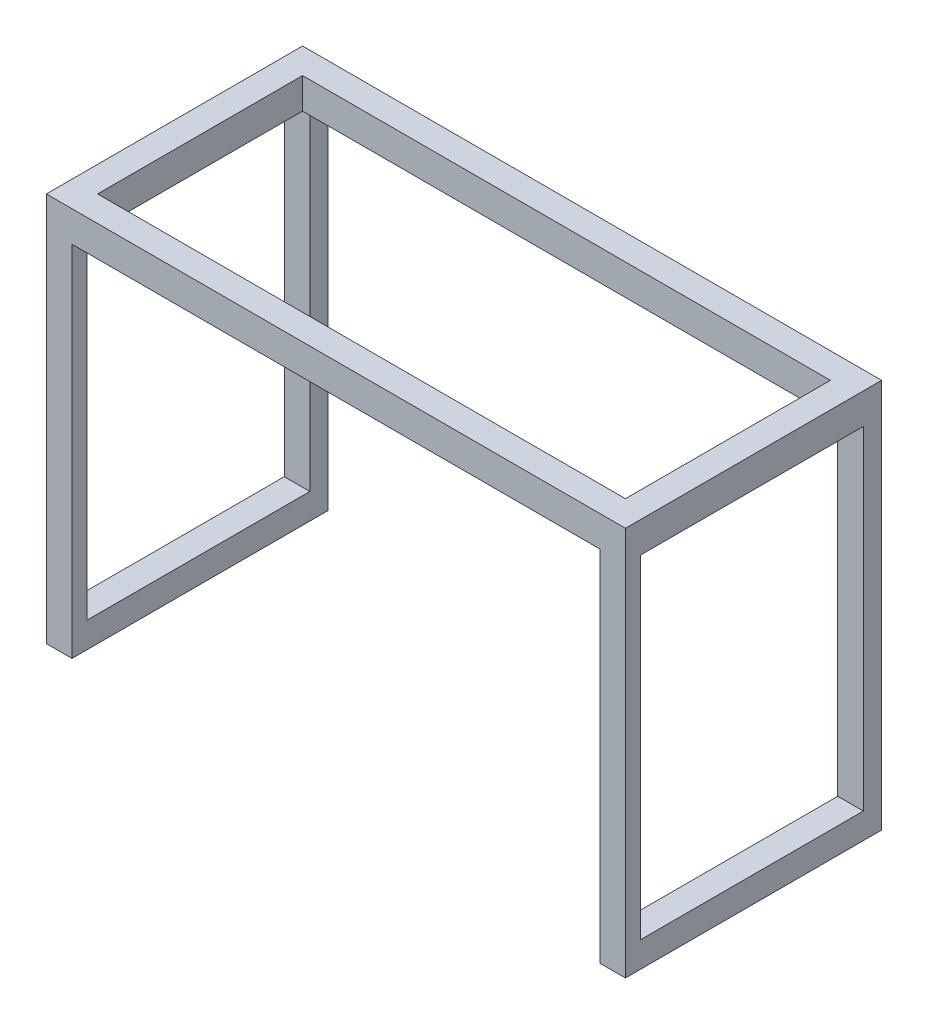
ISO-10303-21;
HEADER;
FILE_DESCRIPTION(('STEP AP214'),'2;1');
FILE_NAME('part.step','',(''),(''),'','','');
FILE_SCHEMA(('AUTOMOTIVE_DESIGN { 1 0 10303 214 1 1 1 1 }'));
ENDSEC;
DATA;
#1=APPLICATION_CONTEXT('core data for automotive mechanical design processes');
#2=APPLICATION_PROTOCOL_DEFINITION('international standard','automotive_design',2000,#1);
#3=PRODUCT_CONTEXT('',#1,'mechanical');
#4=PRODUCT('Part','Part','',(#3));
#5=PRODUCT_RELATED_PRODUCT_CATEGORY('part','',(#4));
#6=PRODUCT_DEFINITION_FORMATION('','',#4);
#7=PRODUCT_DEFINITION_CONTEXT('part definition',#1,'design');
#8=PRODUCT_DEFINITION('design','',#6,#7);
#9=PRODUCT_DEFINITION_SHAPE('','',#8);
#10=(LENGTH_UNIT() NAMED_UNIT(*) SI_UNIT(.MILLI.,.METRE.));
#11=(NAMED_UNIT(*) PLANE_ANGLE_UNIT() SI_UNIT($,.RADIAN.));
#12=(NAMED_UNIT(*) SI_UNIT($,.STERADIAN.) SOLID_ANGLE_UNIT());
#13=UNCERTAINTY_MEASURE_WITH_UNIT(LENGTH_MEASURE(1.E-05),#10,'distance_accuracy_value','');
#14=(GEOMETRIC_REPRESENTATION_CONTEXT(3) GLOBAL_UNCERTAINTY_ASSIGNED_CONTEXT((#13)) GLOBAL_UNIT_ASSIGNED_CONTEXT((#10,
#11,#12)) REPRESENTATION_CONTEXT('',''));
#15=CARTESIAN_POINT('',(0.,0.,0.));
#16=DIRECTION('',(0.,0.,1.));
#17=DIRECTION('',(1.,0.,0.));
#18=AXIS2_PLACEMENT_3D('',#15,#16,#17);
#19=CARTESIAN_POINT('',(-515.,0.,200.));
#20=DIRECTION('',(-1.,0.,0.));
#21=DIRECTION('',(0.,0.,1.));
#22=AXIS2_PLACEMENT_3D('',#19,#20,#21);
#23=PLANE('',#22);
#24=DIRECTION('',(0.,1.,0.));
#25=VECTOR('',#24,1.);
#26=CARTESIAN_POINT('',(-515.,0.,200.));
#27=LINE('',#26,#25);
#28=CARTESIAN_POINT('',(-515.,0.,200.));
#29=VERTEX_POINT('',#28);
#30=CARTESIAN_POINT('',(-515.,60.,200.));
#31=VERTEX_POINT('',#30);
#32=EDGE_CURVE('E275',#29,#31,#27,.T.);
#33=ORIENTED_EDGE('',*,*,#32,.F.);
#34=DIRECTION('',(0.,0.,-1.));
#35=VECTOR('',#34,1.);
#36=CARTESIAN_POINT('',(-515.,0.,200.));
#37=LINE('',#36,#35);
#38=CARTESIAN_POINT('',(-515.,0.,-200.));
#39=VERTEX_POINT('',#38);
#40=EDGE_CURVE('E208',#29,#39,#37,.T.);
#41=ORIENTED_EDGE('',*,*,#40,.T.);
#42=DIRECTION('',(0.,1.,0.));
#43=VECTOR('',#42,1.);
#44=CARTESIAN_POINT('',(-515.,0.,-200.));
#45=LINE('',#44,#43);
#46=CARTESIAN_POINT('',(-515.,60.,-200.));
#47=VERTEX_POINT('',#46);
#48=EDGE_CURVE('E285',#39,#47,#45,.T.);
#49=ORIENTED_EDGE('',*,*,#48,.T.);
#50=DIRECTION('',(0.,0.,1.));
#51=VECTOR('',#50,1.);
#52=CARTESIAN_POINT('',(-515.,60.,200.));
#53=LINE('',#52,#51);
#54=EDGE_CURVE('E267',#47,#31,#53,.T.);
#55=ORIENTED_EDGE('',*,*,#54,.T.);
#56=EDGE_LOOP('',(#33,#41,#49,#55));
#57=FACE_BOUND('',#56,.T.);
#58=ADVANCED_FACE('F35',(#57),#23,.F.);
#59=CARTESIAN_POINT('',(515.,0.,200.));
#60=DIRECTION('',(1.,0.,0.));
#61=DIRECTION('',(0.,0.,-1.));
#62=AXIS2_PLACEMENT_3D('',#59,#60,#61);
#63=PLANE('',#62);
#64=DIRECTION('',(0.,1.,0.));
#65=VECTOR('',#64,1.);
#66=CARTESIAN_POINT('',(515.,0.,-200.));
#67=LINE('',#66,#65);
#68=CARTESIAN_POINT('',(515.,0.,-200.));
#69=VERTEX_POINT('',#68);
#70=CARTESIAN_POINT('',(515.,60.,-200.));
#71=VERTEX_POINT('',#70);
#72=EDGE_CURVE('E288',#69,#71,#67,.T.);
#73=ORIENTED_EDGE('',*,*,#72,.F.);
#74=DIRECTION('',(0.,0.,1.));
#75=VECTOR('',#74,1.);
#76=CARTESIAN_POINT('',(515.,0.,200.));
#77=LINE('',#76,#75);
#78=CARTESIAN_POINT('',(515.,0.,200.));
#79=VERTEX_POINT('',#78);
#80=EDGE_CURVE('E205',#69,#79,#77,.T.);
#81=ORIENTED_EDGE('',*,*,#80,.T.);
#82=DIRECTION('',(0.,1.,0.));
#83=VECTOR('',#82,1.);
#84=CARTESIAN_POINT('',(515.,0.,200.));
#85=LINE('',#84,#83);
#86=CARTESIAN_POINT('',(515.,60.,200.));
#87=VERTEX_POINT('',#86);
#88=EDGE_CURVE('E290',#79,#87,#85,.T.);
#89=ORIENTED_EDGE('',*,*,#88,.T.);
#90=DIRECTION('',(0.,0.,-1.));
#91=VECTOR('',#90,1.);
#92=CARTESIAN_POINT('',(515.,60.,200.));
#93=LINE('',#92,#91);
#94=EDGE_CURVE('E280',#87,#71,#93,.T.);
#95=ORIENTED_EDGE('',*,*,#94,.T.);
#96=EDGE_LOOP('',(#73,#81,#89,#95));
#97=FACE_BOUND('',#96,.T.);
#98=ADVANCED_FACE('F382',(#97),#63,.F.);
#99=CARTESIAN_POINT('',(0.,0.,0.));
#100=DIRECTION('',(0.,1.,0.));
#101=DIRECTION('',(0.,0.,1.));
#102=AXIS2_PLACEMENT_3D('',#99,#100,#101);
#103=PLANE('',#102);
#104=DIRECTION('',(0.,0.,-1.));
#105=VECTOR('',#104,1.);
#106=CARTESIAN_POINT('',(515.,0.,250.));
#107=LINE('',#106,#105);
#108=CARTESIAN_POINT('',(515.,0.,-214.273357981474));
#109=VERTEX_POINT('',#108);
#110=CARTESIAN_POINT('',(515.,0.,-250.));
#111=VERTEX_POINT('',#110);
#112=EDGE_CURVE('E227',#109,#111,#107,.T.);
#113=ORIENTED_EDGE('',*,*,#112,.F.);
#114=DIRECTION('',(-1.,0.,0.));
#115=VECTOR('',#114,1.);
#116=CARTESIAN_POINT('',(1337.,0.,-214.273357981474));
#117=LINE('',#116,#115);
#118=CARTESIAN_POINT('',(565.,0.,-214.273357981474));
#119=VERTEX_POINT('',#118);
#120=EDGE_CURVE('E200',#119,#109,#117,.T.);
#121=ORIENTED_EDGE('',*,*,#120,.F.);
#122=DIRECTION('',(0.,0.,-1.));
#123=VECTOR('',#122,1.);
#124=CARTESIAN_POINT('',(565.,0.,250.));
#125=LINE('',#124,#123);
#126=CARTESIAN_POINT('',(565.,0.,220.54477333703));
#127=VERTEX_POINT('',#126);
#128=EDGE_CURVE('E207',#127,#119,#125,.T.);
#129=ORIENTED_EDGE('',*,*,#128,.F.);
#130=DIRECTION('',(-1.,0.,0.));
#131=VECTOR('',#130,1.);
#132=CARTESIAN_POINT('',(1337.,0.,220.54477333703));
#133=LINE('',#132,#131);
#134=CARTESIAN_POINT('',(515.,0.,220.54477333703));
#135=VERTEX_POINT('',#134);
#136=EDGE_CURVE('E201',#127,#135,#133,.T.);
#137=ORIENTED_EDGE('',*,*,#136,.T.);
#138=CARTESIAN_POINT('',(515.,0.,250.));
#139=VERTEX_POINT('',#138);
#140=EDGE_CURVE('E232',#139,#135,#107,.T.);
#141=ORIENTED_EDGE('',*,*,#140,.F.);
#142=DIRECTION('',(1.,0.,0.));
#143=VECTOR('',#142,1.);
#144=CARTESIAN_POINT('',(565.,0.,250.));
#145=LINE('',#144,#143);
#146=CARTESIAN_POINT('',(-515.,0.,250.));
#147=VERTEX_POINT('',#146);
#148=EDGE_CURVE('E287',#147,#139,#145,.T.);
#149=ORIENTED_EDGE('',*,*,#148,.F.);
#150=DIRECTION('',(0.,0.,1.));
#151=VECTOR('',#150,1.);
#152=CARTESIAN_POINT('',(-515.,0.,250.));
#153=LINE('',#152,#151);
#154=CARTESIAN_POINT('',(-515.,0.,220.54477333703));
#155=VERTEX_POINT('',#154);
#156=EDGE_CURVE('E261',#155,#147,#153,.T.);
#157=ORIENTED_EDGE('',*,*,#156,.F.);
#158=CARTESIAN_POINT('',(-565.,0.,220.54477333703));
#159=VERTEX_POINT('',#158);
#160=EDGE_CURVE('E202',#155,#159,#133,.T.);
#161=ORIENTED_EDGE('',*,*,#160,.T.);
#162=DIRECTION('',(0.,0.,-1.));
#163=VECTOR('',#162,1.);
#164=CARTESIAN_POINT('',(-565.,0.,-214.273357981474));
#165=LINE('',#164,#163);
#166=CARTESIAN_POINT('',(-565.,0.,-214.273357981474));
#167=VERTEX_POINT('',#166);
#168=EDGE_CURVE('E193',#159,#167,#165,.T.);
#169=ORIENTED_EDGE('',*,*,#168,.T.);
#170=CARTESIAN_POINT('',(-515.,0.,-214.273357981474));
#171=VERTEX_POINT('',#170);
#172=EDGE_CURVE('E198',#171,#167,#117,.T.);
#173=ORIENTED_EDGE('',*,*,#172,.F.);
#174=CARTESIAN_POINT('',(-515.,0.,-250.));
#175=VERTEX_POINT('',#174);
#176=EDGE_CURVE('E247',#175,#171,#153,.T.);
#177=ORIENTED_EDGE('',*,*,#176,.F.);
#178=DIRECTION('',(-1.,0.,0.));
#179=VECTOR('',#178,1.);
#180=CARTESIAN_POINT('',(565.,0.,-250.));
#181=LINE('',#180,#179);
#182=EDGE_CURVE('E298',#111,#175,#181,.T.);
#183=ORIENTED_EDGE('',*,*,#182,.F.);
#184=EDGE_LOOP('',(#113,#121,#129,#137,#141,#149,#157,#161,#169,#173,#177,#183));
#185=FACE_BOUND('',#184,.T.);
#186=ORIENTED_EDGE('',*,*,#40,.F.);
#187=DIRECTION('',(1.,0.,0.));
#188=VECTOR('',#187,1.);
#189=CARTESIAN_POINT('',(515.,0.,200.));
#190=LINE('',#189,#188);
#191=EDGE_CURVE('E268',#29,#79,#190,.T.);
#192=ORIENTED_EDGE('',*,*,#191,.T.);
#193=ORIENTED_EDGE('',*,*,#80,.F.);
#194=DIRECTION('',(-1.,0.,0.));
#195=VECTOR('',#194,1.);
#196=CARTESIAN_POINT('',(515.,0.,-200.));
#197=LINE('',#196,#195);
#198=EDGE_CURVE('E271',#69,#39,#197,.T.);
#199=ORIENTED_EDGE('',*,*,#198,.T.);
#200=EDGE_LOOP('',(#186,#192,#193,#199));
#201=FACE_BOUND('',#200,.T.);
#202=ADVANCED_FACE('F326',(#185,#201),#103,.F.);
#203=CARTESIAN_POINT('',(-565.,60.,250.));
#204=DIRECTION('',(1.,0.,0.));
#205=DIRECTION('',(0.,0.,-1.));
#206=AXIS2_PLACEMENT_3D('',#203,#204,#205);
#207=PLANE('',#206);
#208=DIRECTION('',(0.,0.,1.));
#209=VECTOR('',#208,1.);
#210=CARTESIAN_POINT('',(-565.,-650.,-214.273357981474));
#211=LINE('',#210,#209);
#212=CARTESIAN_POINT('',(-565.,-650.,-214.273357981474));
#213=VERTEX_POINT('',#212);
#214=CARTESIAN_POINT('',(-565.,-650.,220.54477333703));
#215=VERTEX_POINT('',#214);
#216=EDGE_CURVE('E186',#213,#215,#211,.T.);
#217=ORIENTED_EDGE('',*,*,#216,.F.);
#218=DIRECTION('',(0.,-1.,0.));
#219=VECTOR('',#218,1.);
#220=CARTESIAN_POINT('',(-565.,0.,-214.273357981474));
#221=LINE('',#220,#219);
#222=EDGE_CURVE('E50',#167,#213,#221,.T.);
#223=ORIENTED_EDGE('',*,*,#222,.F.);
#224=ORIENTED_EDGE('',*,*,#168,.F.);
#225=DIRECTION('',(0.,1.,0.));
#226=VECTOR('',#225,1.);
#227=CARTESIAN_POINT('',(-565.,0.,220.54477333703));
#228=LINE('',#227,#226);
#229=EDGE_CURVE('E177',#215,#159,#228,.T.);
#230=ORIENTED_EDGE('',*,*,#229,.F.);
#231=EDGE_LOOP('',(#217,#223,#224,#230));
#232=FACE_BOUND('',#231,.T.);
#233=DIRECTION('',(0.,-1.,0.));
#234=VECTOR('',#233,1.);
#235=CARTESIAN_POINT('',(-565.,60.,-250.));
#236=LINE('',#235,#234);
#237=CARTESIAN_POINT('',(-565.,60.,-250.));
#238=VERTEX_POINT('',#237);
#239=CARTESIAN_POINT('',(-565.,-700.,-250.));
#240=VERTEX_POINT('',#239);
#241=EDGE_CURVE('E304',#238,#240,#236,.T.);
#242=ORIENTED_EDGE('',*,*,#241,.T.);
#243=DIRECTION('',(0.,0.,-1.));
#244=VECTOR('',#243,1.);
#245=CARTESIAN_POINT('',(-565.,-700.,250.));
#246=LINE('',#245,#244);
#247=CARTESIAN_POINT('',(-565.,-700.,250.));
#248=VERTEX_POINT('',#247);
#249=EDGE_CURVE('E248',#248,#240,#246,.T.);
#250=ORIENTED_EDGE('',*,*,#249,.F.);
#251=DIRECTION('',(0.,-1.,0.));
#252=VECTOR('',#251,1.);
#253=CARTESIAN_POINT('',(-565.,60.,250.));
#254=LINE('',#253,#252);
#255=CARTESIAN_POINT('',(-565.,60.,250.));
#256=VERTEX_POINT('',#255);
#257=EDGE_CURVE('E313',#256,#248,#254,.T.);
#258=ORIENTED_EDGE('',*,*,#257,.F.);
#259=DIRECTION('',(0.,0.,1.));
#260=VECTOR('',#259,1.);
#261=CARTESIAN_POINT('',(-565.,60.,250.));
#262=LINE('',#261,#260);
#263=EDGE_CURVE('E294',#238,#256,#262,.T.);
#264=ORIENTED_EDGE('',*,*,#263,.F.);
#265=EDGE_LOOP('',(#242,#250,#258,#264));
#266=FACE_BOUND('',#265,.T.);
#267=ADVANCED_FACE('F37',(#232,#266),#207,.F.);
#268=CARTESIAN_POINT('',(565.,60.,250.));
#269=DIRECTION('',(0.,0.,-1.));
#270=DIRECTION('',(-1.,0.,0.));
#271=AXIS2_PLACEMENT_3D('',#268,#269,#270);
#272=PLANE('',#271);
#273=ORIENTED_EDGE('',*,*,#257,.T.);
#274=DIRECTION('',(-1.,0.,0.));
#275=VECTOR('',#274,1.);
#276=CARTESIAN_POINT('',(-565.,-700.,250.));
#277=LINE('',#276,#275);
#278=CARTESIAN_POINT('',(-515.,-700.,250.));
#279=VERTEX_POINT('',#278);
#280=EDGE_CURVE('E255',#279,#248,#277,.T.);
#281=ORIENTED_EDGE('',*,*,#280,.F.);
#282=DIRECTION('',(0.,1.,0.));
#283=VECTOR('',#282,1.);
#284=CARTESIAN_POINT('',(-515.,-700.,250.));
#285=LINE('',#284,#283);
#286=EDGE_CURVE('E258',#279,#147,#285,.T.);
#287=ORIENTED_EDGE('',*,*,#286,.T.);
#288=ORIENTED_EDGE('',*,*,#148,.T.);
#289=DIRECTION('',(0.,1.,0.));
#290=VECTOR('',#289,1.);
#291=CARTESIAN_POINT('',(515.,-700.,250.));
#292=LINE('',#291,#290);
#293=CARTESIAN_POINT('',(515.,-700.,250.));
#294=VERTEX_POINT('',#293);
#295=EDGE_CURVE('E244',#294,#139,#292,.T.);
#296=ORIENTED_EDGE('',*,*,#295,.F.);
#297=DIRECTION('',(-1.,0.,0.));
#298=VECTOR('',#297,1.);
#299=CARTESIAN_POINT('',(565.,-700.,250.));
#300=LINE('',#299,#298);
#301=CARTESIAN_POINT('',(565.,-700.,250.));
#302=VERTEX_POINT('',#301);
#303=EDGE_CURVE('E231',#302,#294,#300,.T.);
#304=ORIENTED_EDGE('',*,*,#303,.F.);
#305=DIRECTION('',(0.,-1.,0.));
#306=VECTOR('',#305,1.);
#307=CARTESIAN_POINT('',(565.,60.,250.));
#308=LINE('',#307,#306);
#309=CARTESIAN_POINT('',(565.,60.,250.));
#310=VERTEX_POINT('',#309);
#311=EDGE_CURVE('E311',#310,#302,#308,.T.);
#312=ORIENTED_EDGE('',*,*,#311,.F.);
#313=DIRECTION('',(1.,0.,0.));
#314=VECTOR('',#313,1.);
#315=CARTESIAN_POINT('',(565.,60.,250.));
#316=LINE('',#315,#314);
#317=EDGE_CURVE('E297',#256,#310,#316,.T.);
#318=ORIENTED_EDGE('',*,*,#317,.F.);
#319=EDGE_LOOP('',(#273,#281,#287,#288,#296,#304,#312,#318));
#320=FACE_BOUND('',#319,.T.);
#321=ADVANCED_FACE('F354',(#320),#272,.F.);
#322=CARTESIAN_POINT('',(565.,60.,250.));
#323=DIRECTION('',(-1.,0.,0.));
#324=DIRECTION('',(0.,0.,1.));
#325=AXIS2_PLACEMENT_3D('',#322,#323,#324);
#326=PLANE('',#325);
#327=ORIENTED_EDGE('',*,*,#128,.T.);
#328=DIRECTION('',(0.,-1.,0.));
#329=VECTOR('',#328,1.);
#330=CARTESIAN_POINT('',(565.,59.9999999999999,-214.273357981474));
#331=LINE('',#330,#329);
#332=CARTESIAN_POINT('',(565.,-650.,-214.273357981474));
#333=VERTEX_POINT('',#332);
#334=EDGE_CURVE('E224',#119,#333,#331,.T.);
#335=ORIENTED_EDGE('',*,*,#334,.T.);
#336=DIRECTION('',(0.,0.,1.));
#337=VECTOR('',#336,1.);
#338=CARTESIAN_POINT('',(565.,-650.,250.));
#339=LINE('',#338,#337);
#340=CARTESIAN_POINT('',(565.,-650.,220.54477333703));
#341=VERTEX_POINT('',#340);
#342=EDGE_CURVE('E214',#333,#341,#339,.T.);
#343=ORIENTED_EDGE('',*,*,#342,.T.);
#344=DIRECTION('',(0.,1.,0.));
#345=VECTOR('',#344,1.);
#346=CARTESIAN_POINT('',(565.,60.,220.54477333703));
#347=LINE('',#346,#345);
#348=EDGE_CURVE('E218',#341,#127,#347,.T.);
#349=ORIENTED_EDGE('',*,*,#348,.T.);
#350=EDGE_LOOP('',(#327,#335,#343,#349));
#351=FACE_BOUND('',#350,.T.);
#352=ORIENTED_EDGE('',*,*,#311,.T.);
#353=DIRECTION('',(0.,0.,1.));
#354=VECTOR('',#353,1.);
#355=CARTESIAN_POINT('',(565.,-700.,250.));
#356=LINE('',#355,#354);
#357=CARTESIAN_POINT('',(565.,-700.,-249.999999999999));
#358=VERTEX_POINT('',#357);
#359=EDGE_CURVE('E228',#358,#302,#356,.T.);
#360=ORIENTED_EDGE('',*,*,#359,.F.);
#361=DIRECTION('',(0.,-1.,0.));
#362=VECTOR('',#361,1.);
#363=CARTESIAN_POINT('',(565.,60.,-250.));
#364=LINE('',#363,#362);
#365=CARTESIAN_POINT('',(565.,60.,-250.));
#366=VERTEX_POINT('',#365);
#367=EDGE_CURVE('E309',#366,#358,#364,.T.);
#368=ORIENTED_EDGE('',*,*,#367,.F.);
#369=DIRECTION('',(0.,0.,-1.));
#370=VECTOR('',#369,1.);
#371=CARTESIAN_POINT('',(565.,60.,250.));
#372=LINE('',#371,#370);
#373=EDGE_CURVE('E300',#310,#366,#372,.T.);
#374=ORIENTED_EDGE('',*,*,#373,.F.);
#375=EDGE_LOOP('',(#352,#360,#368,#374));
#376=FACE_BOUND('',#375,.T.);
#377=ADVANCED_FACE('F331',(#351,#376),#326,.F.);
#378=CARTESIAN_POINT('',(565.,60.,-250.));
#379=DIRECTION('',(0.,0.,1.));
#380=DIRECTION('',(1.,0.,0.));
#381=AXIS2_PLACEMENT_3D('',#378,#379,#380);
#382=PLANE('',#381);
#383=ORIENTED_EDGE('',*,*,#367,.T.);
#384=DIRECTION('',(1.,0.,0.));
#385=VECTOR('',#384,1.);
#386=CARTESIAN_POINT('',(565.,-700.,-249.999999999999));
#387=LINE('',#386,#385);
#388=CARTESIAN_POINT('',(515.,-700.,-249.999999999999));
#389=VERTEX_POINT('',#388);
#390=EDGE_CURVE('E236',#389,#358,#387,.T.);
#391=ORIENTED_EDGE('',*,*,#390,.F.);
#392=DIRECTION('',(0.,1.,0.));
#393=VECTOR('',#392,1.);
#394=CARTESIAN_POINT('',(515.,-700.,-249.999999999999));
#395=LINE('',#394,#393);
#396=EDGE_CURVE('E239',#389,#111,#395,.T.);
#397=ORIENTED_EDGE('',*,*,#396,.T.);
#398=ORIENTED_EDGE('',*,*,#182,.T.);
#399=DIRECTION('',(0.,1.,0.));
#400=VECTOR('',#399,1.);
#401=CARTESIAN_POINT('',(-515.,-700.,-250.));
#402=LINE('',#401,#400);
#403=CARTESIAN_POINT('',(-515.,-700.,-250.));
#404=VERTEX_POINT('',#403);
#405=EDGE_CURVE('E264',#404,#175,#402,.T.);
#406=ORIENTED_EDGE('',*,*,#405,.F.);
#407=DIRECTION('',(1.,0.,0.));
#408=VECTOR('',#407,1.);
#409=CARTESIAN_POINT('',(-565.,-700.,-250.));
#410=LINE('',#409,#408);
#411=EDGE_CURVE('E251',#240,#404,#410,.T.);
#412=ORIENTED_EDGE('',*,*,#411,.F.);
#413=ORIENTED_EDGE('',*,*,#241,.F.);
#414=DIRECTION('',(-1.,0.,0.));
#415=VECTOR('',#414,1.);
#416=CARTESIAN_POINT('',(565.,60.,-250.));
#417=LINE('',#416,#415);
#418=EDGE_CURVE('E302',#366,#238,#417,.T.);
#419=ORIENTED_EDGE('',*,*,#418,.F.);
#420=EDGE_LOOP('',(#383,#391,#397,#398,#406,#412,#413,#419));
#421=FACE_BOUND('',#420,.T.);
#422=ADVANCED_FACE('F345',(#421),#382,.F.);
#423=CARTESIAN_POINT('',(0.,60.,0.));
#424=DIRECTION('',(0.,1.,0.));
#425=DIRECTION('',(0.,0.,1.));
#426=AXIS2_PLACEMENT_3D('',#423,#424,#425);
#427=PLANE('',#426);
#428=ORIENTED_EDGE('',*,*,#54,.F.);
#429=DIRECTION('',(-1.,0.,0.));
#430=VECTOR('',#429,1.);
#431=CARTESIAN_POINT('',(515.,60.,-200.));
#432=LINE('',#431,#430);
#433=EDGE_CURVE('E272',#71,#47,#432,.T.);
#434=ORIENTED_EDGE('',*,*,#433,.F.);
#435=ORIENTED_EDGE('',*,*,#94,.F.);
#436=DIRECTION('',(1.,0.,0.));
#437=VECTOR('',#436,1.);
#438=CARTESIAN_POINT('',(515.,60.,200.));
#439=LINE('',#438,#437);
#440=EDGE_CURVE('E277',#31,#87,#439,.T.);
#441=ORIENTED_EDGE('',*,*,#440,.F.);
#442=EDGE_LOOP('',(#428,#434,#435,#441));
#443=FACE_BOUND('',#442,.T.);
#444=ORIENTED_EDGE('',*,*,#263,.T.);
#445=ORIENTED_EDGE('',*,*,#317,.T.);
#446=ORIENTED_EDGE('',*,*,#373,.T.);
#447=ORIENTED_EDGE('',*,*,#418,.T.);
#448=EDGE_LOOP('',(#444,#445,#446,#447));
#449=FACE_BOUND('',#448,.T.);
#450=ADVANCED_FACE('F371',(#443,#449),#427,.T.);
#451=ORIENTED_EDGE('',*,*,#176,.T.);
#452=DIRECTION('',(0.,-1.,0.));
#453=VECTOR('',#452,1.);
#454=CARTESIAN_POINT('',(-515.,0.,-214.273357981474));
#455=LINE('',#454,#453);
#456=CARTESIAN_POINT('',(-515.,-650.,-214.273357981474));
#457=VERTEX_POINT('',#456);
#458=EDGE_CURVE('E221',#171,#457,#455,.T.);
#459=ORIENTED_EDGE('',*,*,#458,.T.);
#460=DIRECTION('',(0.,0.,1.));
#461=VECTOR('',#460,1.);
#462=CARTESIAN_POINT('',(-515.,-650.,200.));
#463=LINE('',#462,#461);
#464=CARTESIAN_POINT('',(-515.,-650.,220.54477333703));
#465=VERTEX_POINT('',#464);
#466=EDGE_CURVE('E212',#457,#465,#463,.T.);
#467=ORIENTED_EDGE('',*,*,#466,.T.);
#468=DIRECTION('',(0.,1.,0.));
#469=VECTOR('',#468,1.);
#470=CARTESIAN_POINT('',(-515.,0.,220.54477333703));
#471=LINE('',#470,#469);
#472=EDGE_CURVE('E180',#465,#155,#471,.T.);
#473=ORIENTED_EDGE('',*,*,#472,.T.);
#474=ORIENTED_EDGE('',*,*,#156,.T.);
#475=ORIENTED_EDGE('',*,*,#286,.F.);
#476=DIRECTION('',(0.,0.,1.));
#477=VECTOR('',#476,1.);
#478=CARTESIAN_POINT('',(-515.,-700.,250.));
#479=LINE('',#478,#477);
#480=EDGE_CURVE('E253',#404,#279,#479,.T.);
#481=ORIENTED_EDGE('',*,*,#480,.F.);
#482=ORIENTED_EDGE('',*,*,#405,.T.);
#483=EDGE_LOOP('',(#451,#459,#467,#473,#474,#475,#481,#482));
#484=FACE_BOUND('',#483,.T.);
#485=ADVANCED_FACE('F359',(#484),#23,.F.);
#486=CARTESIAN_POINT('',(515.,0.,-200.));
#487=DIRECTION('',(0.,0.,-1.));
#488=DIRECTION('',(-1.,0.,0.));
#489=AXIS2_PLACEMENT_3D('',#486,#487,#488);
#490=PLANE('',#489);
#491=ORIENTED_EDGE('',*,*,#433,.T.);
#492=ORIENTED_EDGE('',*,*,#48,.F.);
#493=ORIENTED_EDGE('',*,*,#198,.F.);
#494=ORIENTED_EDGE('',*,*,#72,.T.);
#495=EDGE_LOOP('',(#491,#492,#493,#494));
#496=FACE_BOUND('',#495,.T.);
#497=ADVANCED_FACE('F394',(#496),#490,.F.);
#498=DIRECTION('',(0.,0.,-1.));
#499=VECTOR('',#498,1.);
#500=CARTESIAN_POINT('',(515.,-650.,200.));
#501=LINE('',#500,#499);
#502=CARTESIAN_POINT('',(515.,-650.,220.54477333703));
#503=VERTEX_POINT('',#502);
#504=CARTESIAN_POINT('',(515.,-650.,-214.273357981474));
#505=VERTEX_POINT('',#504);
#506=EDGE_CURVE('E315',#503,#505,#501,.T.);
#507=ORIENTED_EDGE('',*,*,#506,.T.);
#508=DIRECTION('',(0.,1.,0.));
#509=VECTOR('',#508,1.);
#510=CARTESIAN_POINT('',(515.,0.,-214.273357981474));
#511=LINE('',#510,#509);
#512=EDGE_CURVE('E11',#505,#109,#511,.T.);
#513=ORIENTED_EDGE('',*,*,#512,.T.);
#514=ORIENTED_EDGE('',*,*,#112,.T.);
#515=ORIENTED_EDGE('',*,*,#396,.F.);
#516=DIRECTION('',(0.,0.,-1.));
#517=VECTOR('',#516,1.);
#518=CARTESIAN_POINT('',(515.,-700.,250.));
#519=LINE('',#518,#517);
#520=EDGE_CURVE('E234',#294,#389,#519,.T.);
#521=ORIENTED_EDGE('',*,*,#520,.F.);
#522=ORIENTED_EDGE('',*,*,#295,.T.);
#523=ORIENTED_EDGE('',*,*,#140,.T.);
#524=DIRECTION('',(0.,-1.,0.));
#525=VECTOR('',#524,1.);
#526=CARTESIAN_POINT('',(515.,0.,220.54477333703));
#527=LINE('',#526,#525);
#528=EDGE_CURVE('E43',#135,#503,#527,.T.);
#529=ORIENTED_EDGE('',*,*,#528,.T.);
#530=EDGE_LOOP('',(#507,#513,#514,#515,#521,#522,#523,#529));
#531=FACE_BOUND('',#530,.T.);
#532=ADVANCED_FACE('F319',(#531),#63,.F.);
#533=CARTESIAN_POINT('',(515.,0.,200.));
#534=DIRECTION('',(0.,0.,1.));
#535=DIRECTION('',(1.,0.,0.));
#536=AXIS2_PLACEMENT_3D('',#533,#534,#535);
#537=PLANE('',#536);
#538=ORIENTED_EDGE('',*,*,#440,.T.);
#539=ORIENTED_EDGE('',*,*,#88,.F.);
#540=ORIENTED_EDGE('',*,*,#191,.F.);
#541=ORIENTED_EDGE('',*,*,#32,.T.);
#542=EDGE_LOOP('',(#538,#539,#540,#541));
#543=FACE_BOUND('',#542,.T.);
#544=ADVANCED_FACE('F452',(#543),#537,.F.);
#545=CARTESIAN_POINT('',(0.,-700.,0.));
#546=DIRECTION('',(0.,-1.,0.));
#547=DIRECTION('',(0.,0.,-1.));
#548=AXIS2_PLACEMENT_3D('',#545,#546,#547);
#549=PLANE('',#548);
#550=ORIENTED_EDGE('',*,*,#249,.T.);
#551=ORIENTED_EDGE('',*,*,#411,.T.);
#552=ORIENTED_EDGE('',*,*,#480,.T.);
#553=ORIENTED_EDGE('',*,*,#280,.T.);
#554=EDGE_LOOP('',(#550,#551,#552,#553));
#555=FACE_BOUND('',#554,.T.);
#556=ADVANCED_FACE('F368',(#555),#549,.T.);
#557=CARTESIAN_POINT('',(0.,-700.,0.));
#558=DIRECTION('',(0.,1.,0.));
#559=DIRECTION('',(0.,0.,1.));
#560=AXIS2_PLACEMENT_3D('',#557,#558,#559);
#561=PLANE('',#560);
#562=ORIENTED_EDGE('',*,*,#359,.T.);
#563=ORIENTED_EDGE('',*,*,#303,.T.);
#564=ORIENTED_EDGE('',*,*,#520,.T.);
#565=ORIENTED_EDGE('',*,*,#390,.T.);
#566=EDGE_LOOP('',(#562,#563,#564,#565));
#567=FACE_BOUND('',#566,.T.);
#568=ADVANCED_FACE('F349',(#567),#561,.F.);
#569=CARTESIAN_POINT('',(1337.,-650.,-214.273357981474));
#570=DIRECTION('',(0.,-1.,0.));
#571=DIRECTION('',(0.,0.,-1.));
#572=AXIS2_PLACEMENT_3D('',#569,#570,#571);
#573=PLANE('',#572);
#574=DIRECTION('',(-1.,0.,0.));
#575=VECTOR('',#574,1.);
#576=CARTESIAN_POINT('',(1337.,-650.,-214.273357981474));
#577=LINE('',#576,#575);
#578=EDGE_CURVE('E183',#333,#505,#577,.T.);
#579=ORIENTED_EDGE('',*,*,#578,.T.);
#580=ORIENTED_EDGE('',*,*,#506,.F.);
#581=DIRECTION('',(-1.,0.,0.));
#582=VECTOR('',#581,1.);
#583=CARTESIAN_POINT('',(1337.,-650.,220.54477333703));
#584=LINE('',#583,#582);
#585=EDGE_CURVE('E58',#341,#503,#584,.T.);
#586=ORIENTED_EDGE('',*,*,#585,.F.);
#587=ORIENTED_EDGE('',*,*,#342,.F.);
#588=EDGE_LOOP('',(#579,#580,#586,#587));
#589=FACE_BOUND('',#588,.T.);
#590=ADVANCED_FACE('F334',(#589),#573,.F.);
#591=CARTESIAN_POINT('',(1337.,0.,220.54477333703));
#592=DIRECTION('',(0.,0.,1.));
#593=DIRECTION('',(0.,-1.,0.));
#594=AXIS2_PLACEMENT_3D('',#591,#592,#593);
#595=PLANE('',#594);
#596=ORIENTED_EDGE('',*,*,#585,.T.);
#597=ORIENTED_EDGE('',*,*,#528,.F.);
#598=ORIENTED_EDGE('',*,*,#136,.F.);
#599=ORIENTED_EDGE('',*,*,#348,.F.);
#600=EDGE_LOOP('',(#596,#597,#598,#599));
#601=FACE_BOUND('',#600,.T.);
#602=ADVANCED_FACE('F323',(#601),#595,.F.);
#603=CARTESIAN_POINT('',(1337.,0.,-214.273357981474));
#604=DIRECTION('',(0.,0.,-1.));
#605=DIRECTION('',(0.,1.,0.));
#606=AXIS2_PLACEMENT_3D('',#603,#604,#605);
#607=PLANE('',#606);
#608=ORIENTED_EDGE('',*,*,#120,.T.);
#609=ORIENTED_EDGE('',*,*,#512,.F.);
#610=ORIENTED_EDGE('',*,*,#578,.F.);
#611=ORIENTED_EDGE('',*,*,#334,.F.);
#612=EDGE_LOOP('',(#608,#609,#610,#611));
#613=FACE_BOUND('',#612,.T.);
#614=ADVANCED_FACE('F337',(#613),#607,.F.);
#615=ORIENTED_EDGE('',*,*,#172,.T.);
#616=ORIENTED_EDGE('',*,*,#222,.T.);
#617=EDGE_CURVE('E188',#457,#213,#577,.T.);
#618=ORIENTED_EDGE('',*,*,#617,.F.);
#619=ORIENTED_EDGE('',*,*,#458,.F.);
#620=EDGE_LOOP('',(#615,#616,#618,#619));
#621=FACE_BOUND('',#620,.T.);
#622=ADVANCED_FACE('F361',(#621),#607,.F.);
#623=EDGE_CURVE('E173',#465,#215,#584,.T.);
#624=ORIENTED_EDGE('',*,*,#623,.T.);
#625=ORIENTED_EDGE('',*,*,#229,.T.);
#626=ORIENTED_EDGE('',*,*,#160,.F.);
#627=ORIENTED_EDGE('',*,*,#472,.F.);
#628=EDGE_LOOP('',(#624,#625,#626,#627));
#629=FACE_BOUND('',#628,.T.);
#630=ADVANCED_FACE('F175',(#629),#595,.F.);
#631=ORIENTED_EDGE('',*,*,#617,.T.);
#632=ORIENTED_EDGE('',*,*,#216,.T.);
#633=ORIENTED_EDGE('',*,*,#623,.F.);
#634=ORIENTED_EDGE('',*,*,#466,.F.);
#635=EDGE_LOOP('',(#631,#632,#633,#634));
#636=FACE_BOUND('',#635,.T.);
#637=ADVANCED_FACE('F187',(#636),#573,.F.);
#638=CLOSED_SHELL('',(#58,#98,#202,#267,#321,#377,#422,#450,#485,#497,#532,#544,#556,#568,#590,
#602,#614,#622,#630,#637));
#639=MANIFOLD_SOLID_BREP('B2',#638);
#640=ADVANCED_BREP_SHAPE_REPRESENTATION('',(#18,#639),#14);
#641=SHAPE_DEFINITION_REPRESENTATION(#9,#640);
ENDSEC;
END-ISO-10303-21;
